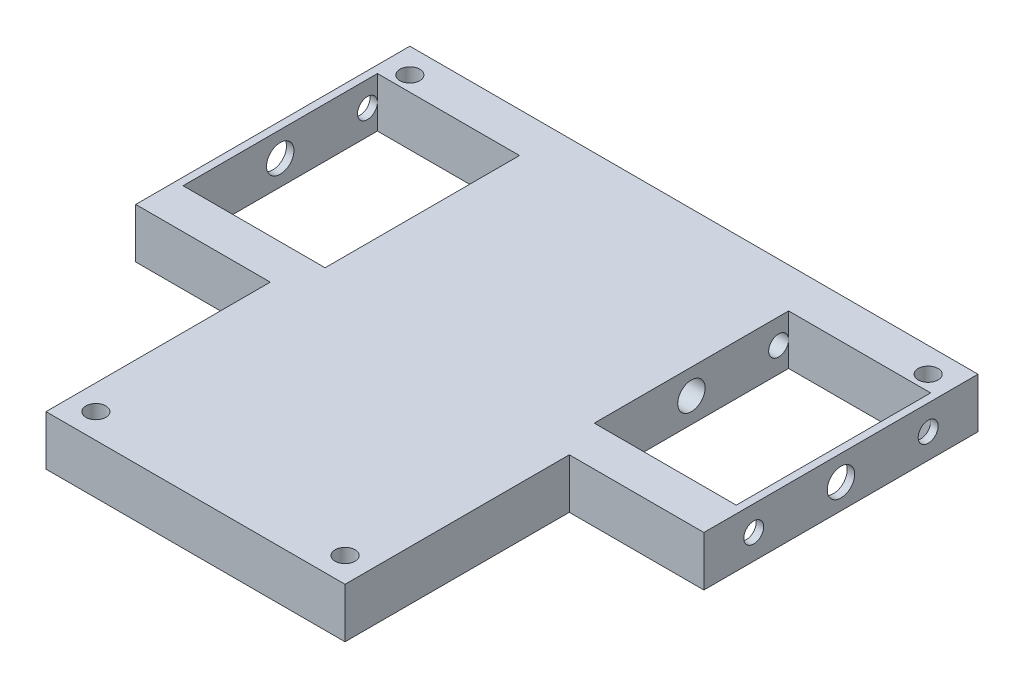
ISO-10303-21;
HEADER;
FILE_DESCRIPTION(('STEP AP214'),'2;1');
FILE_NAME('part.step','',(''),(''),'','','');
FILE_SCHEMA(('AUTOMOTIVE_DESIGN { 1 0 10303 214 1 1 1 1 }'));
ENDSEC;
DATA;
#1=APPLICATION_CONTEXT('core data for automotive mechanical design processes');
#2=APPLICATION_PROTOCOL_DEFINITION('international standard','automotive_design',2000,#1);
#3=PRODUCT_CONTEXT('',#1,'mechanical');
#4=PRODUCT('Part','Part','',(#3));
#5=PRODUCT_RELATED_PRODUCT_CATEGORY('part','',(#4));
#6=PRODUCT_DEFINITION_FORMATION('','',#4);
#7=PRODUCT_DEFINITION_CONTEXT('part definition',#1,'design');
#8=PRODUCT_DEFINITION('design','',#6,#7);
#9=PRODUCT_DEFINITION_SHAPE('','',#8);
#10=(LENGTH_UNIT() NAMED_UNIT(*) SI_UNIT(.MILLI.,.METRE.));
#11=(NAMED_UNIT(*) PLANE_ANGLE_UNIT() SI_UNIT($,.RADIAN.));
#12=(NAMED_UNIT(*) SI_UNIT($,.STERADIAN.) SOLID_ANGLE_UNIT());
#13=UNCERTAINTY_MEASURE_WITH_UNIT(LENGTH_MEASURE(1.E-05),#10,'distance_accuracy_value','');
#14=(GEOMETRIC_REPRESENTATION_CONTEXT(3) GLOBAL_UNCERTAINTY_ASSIGNED_CONTEXT((#13)) GLOBAL_UNIT_ASSIGNED_CONTEXT((#10,
#11,#12)) REPRESENTATION_CONTEXT('',''));
#15=CARTESIAN_POINT('',(0.,0.,0.));
#16=DIRECTION('',(0.,0.,1.));
#17=DIRECTION('',(1.,0.,0.));
#18=AXIS2_PLACEMENT_3D('',#15,#16,#17);
#19=CARTESIAN_POINT('',(0.,10.,0.));
#20=DIRECTION('',(0.,1.,0.));
#21=DIRECTION('',(0.,0.,1.));
#22=AXIS2_PLACEMENT_3D('',#19,#20,#21);
#23=PLANE('',#22);
#24=CARTESIAN_POINT('',(-25.,10.,-5.));
#25=DIRECTION('',(0.,1.,0.));
#26=DIRECTION('',(0.,0.,1.));
#27=AXIS2_PLACEMENT_3D('',#24,#25,#26);
#28=CIRCLE('',#27,2.);
#29=CARTESIAN_POINT('',(-25.,10.,-3.));
#30=VERTEX_POINT('',#29);
#31=EDGE_CURVE('E243',#30,#30,#28,.T.);
#32=ORIENTED_EDGE('',*,*,#31,.F.);
#33=EDGE_LOOP('',(#32));
#34=FACE_BOUND('',#33,.T.);
#35=DIRECTION('',(0.,0.,-1.));
#36=VECTOR('',#35,1.);
#37=CARTESIAN_POINT('',(-30.,10.,0.));
#38=LINE('',#37,#36);
#39=CARTESIAN_POINT('',(-30.,10.,0.));
#40=VERTEX_POINT('',#39);
#41=CARTESIAN_POINT('',(-30.,10.,-45.));
#42=VERTEX_POINT('',#41);
#43=EDGE_CURVE('E277',#40,#42,#38,.T.);
#44=ORIENTED_EDGE('',*,*,#43,.F.);
#45=DIRECTION('',(-1.,0.,0.));
#46=VECTOR('',#45,1.);
#47=CARTESIAN_POINT('',(30.,10.,0.));
#48=LINE('',#47,#46);
#49=CARTESIAN_POINT('',(30.,10.,0.));
#50=VERTEX_POINT('',#49);
#51=EDGE_CURVE('E296',#50,#40,#48,.T.);
#52=ORIENTED_EDGE('',*,*,#51,.F.);
#53=DIRECTION('',(0.,0.,-1.));
#54=VECTOR('',#53,1.);
#55=CARTESIAN_POINT('',(30.,10.,0.));
#56=LINE('',#55,#54);
#57=CARTESIAN_POINT('',(30.,10.,-45.));
#58=VERTEX_POINT('',#57);
#59=EDGE_CURVE('E294',#50,#58,#56,.T.);
#60=ORIENTED_EDGE('',*,*,#59,.T.);
#61=DIRECTION('',(1.,0.,0.));
#62=VECTOR('',#61,1.);
#63=CARTESIAN_POINT('',(30.,10.,-45.));
#64=LINE('',#63,#62);
#65=CARTESIAN_POINT('',(57.,10.,-45.));
#66=VERTEX_POINT('',#65);
#67=EDGE_CURVE('E292',#58,#66,#64,.T.);
#68=ORIENTED_EDGE('',*,*,#67,.T.);
#69=DIRECTION('',(0.,0.,-1.));
#70=VECTOR('',#69,1.);
#71=CARTESIAN_POINT('',(57.,10.,-45.));
#72=LINE('',#71,#70);
#73=CARTESIAN_POINT('',(57.,10.,-100.));
#74=VERTEX_POINT('',#73);
#75=EDGE_CURVE('E290',#66,#74,#72,.T.);
#76=ORIENTED_EDGE('',*,*,#75,.T.);
#77=DIRECTION('',(1.,0.,0.));
#78=VECTOR('',#77,1.);
#79=CARTESIAN_POINT('',(-57.,10.,-100.));
#80=LINE('',#79,#78);
#81=CARTESIAN_POINT('',(-57.,10.,-100.));
#82=VERTEX_POINT('',#81);
#83=EDGE_CURVE('E287',#82,#74,#80,.T.);
#84=ORIENTED_EDGE('',*,*,#83,.F.);
#85=DIRECTION('',(0.,0.,-1.));
#86=VECTOR('',#85,1.);
#87=CARTESIAN_POINT('',(-57.,10.,-45.));
#88=LINE('',#87,#86);
#89=CARTESIAN_POINT('',(-57.,10.,-45.));
#90=VERTEX_POINT('',#89);
#91=EDGE_CURVE('E284',#90,#82,#88,.T.);
#92=ORIENTED_EDGE('',*,*,#91,.F.);
#93=DIRECTION('',(-1.,0.,0.));
#94=VECTOR('',#93,1.);
#95=CARTESIAN_POINT('',(-30.,10.,-45.));
#96=LINE('',#95,#94);
#97=EDGE_CURVE('E280',#42,#90,#96,.T.);
#98=ORIENTED_EDGE('',*,*,#97,.F.);
#99=EDGE_LOOP('',(#44,#52,#60,#68,#76,#84,#92,#98));
#100=FACE_BOUND('',#99,.T.);
#101=CARTESIAN_POINT('',(52.,10.,-95.));
#102=DIRECTION('',(0.,1.,0.));
#103=DIRECTION('',(0.,0.,1.));
#104=AXIS2_PLACEMENT_3D('',#101,#102,#103);
#105=CIRCLE('',#104,2.);
#106=CARTESIAN_POINT('',(52.,10.,-93.));
#107=VERTEX_POINT('',#106);
#108=EDGE_CURVE('E240',#107,#107,#105,.F.);
#109=ORIENTED_EDGE('',*,*,#108,.T.);
#110=EDGE_LOOP('',(#109));
#111=FACE_BOUND('',#110,.T.);
#112=CARTESIAN_POINT('',(25.,10.,-5.00000000000006));
#113=DIRECTION('',(0.,1.,0.));
#114=DIRECTION('',(0.,0.,1.));
#115=AXIS2_PLACEMENT_3D('',#112,#113,#114);
#116=CIRCLE('',#115,2.);
#117=CARTESIAN_POINT('',(25.,10.,-3.00000000000005));
#118=VERTEX_POINT('',#117);
#119=EDGE_CURVE('E246',#118,#118,#116,.F.);
#120=ORIENTED_EDGE('',*,*,#119,.T.);
#121=EDGE_LOOP('',(#120));
#122=FACE_BOUND('',#121,.T.);
#123=DIRECTION('',(0.,0.,-1.));
#124=VECTOR('',#123,1.);
#125=CARTESIAN_POINT('',(-55.5,10.,0.));
#126=LINE('',#125,#124);
#127=CARTESIAN_POINT('',(-55.5,10.,-53.));
#128=VERTEX_POINT('',#127);
#129=CARTESIAN_POINT('',(-55.5,10.,-92.));
#130=VERTEX_POINT('',#129);
#131=EDGE_CURVE('E249',#128,#130,#126,.T.);
#132=ORIENTED_EDGE('',*,*,#131,.T.);
#133=DIRECTION('',(1.,0.,0.));
#134=VECTOR('',#133,1.);
#135=CARTESIAN_POINT('',(0.,10.,-92.));
#136=LINE('',#135,#134);
#137=CARTESIAN_POINT('',(-27.,10.,-92.));
#138=VERTEX_POINT('',#137);
#139=EDGE_CURVE('E258',#130,#138,#136,.T.);
#140=ORIENTED_EDGE('',*,*,#139,.T.);
#141=DIRECTION('',(0.,0.,1.));
#142=VECTOR('',#141,1.);
#143=CARTESIAN_POINT('',(-27.,10.,0.));
#144=LINE('',#143,#142);
#145=CARTESIAN_POINT('',(-27.,10.,-53.));
#146=VERTEX_POINT('',#145);
#147=EDGE_CURVE('E255',#138,#146,#144,.T.);
#148=ORIENTED_EDGE('',*,*,#147,.T.);
#149=DIRECTION('',(1.,0.,0.));
#150=VECTOR('',#149,1.);
#151=CARTESIAN_POINT('',(0.,10.,-53.));
#152=LINE('',#151,#150);
#153=EDGE_CURVE('E252',#128,#146,#152,.T.);
#154=ORIENTED_EDGE('',*,*,#153,.F.);
#155=EDGE_LOOP('',(#132,#140,#148,#154));
#156=FACE_BOUND('',#155,.T.);
#157=DIRECTION('',(-1.,0.,0.));
#158=VECTOR('',#157,1.);
#159=CARTESIAN_POINT('',(0.,10.,-92.));
#160=LINE('',#159,#158);
#161=CARTESIAN_POINT('',(55.5,10.,-92.));
#162=VERTEX_POINT('',#161);
#163=CARTESIAN_POINT('',(27.,10.,-92.));
#164=VERTEX_POINT('',#163);
#165=EDGE_CURVE('E270',#162,#164,#160,.T.);
#166=ORIENTED_EDGE('',*,*,#165,.F.);
#167=DIRECTION('',(0.,0.,-1.));
#168=VECTOR('',#167,1.);
#169=CARTESIAN_POINT('',(55.5,10.,0.));
#170=LINE('',#169,#168);
#171=CARTESIAN_POINT('',(55.5,10.,-53.));
#172=VERTEX_POINT('',#171);
#173=EDGE_CURVE('E267',#172,#162,#170,.T.);
#174=ORIENTED_EDGE('',*,*,#173,.F.);
#175=DIRECTION('',(-1.,0.,0.));
#176=VECTOR('',#175,1.);
#177=CARTESIAN_POINT('',(0.,10.,-53.));
#178=LINE('',#177,#176);
#179=CARTESIAN_POINT('',(27.,10.,-53.));
#180=VERTEX_POINT('',#179);
#181=EDGE_CURVE('E264',#172,#180,#178,.T.);
#182=ORIENTED_EDGE('',*,*,#181,.T.);
#183=DIRECTION('',(0.,0.,1.));
#184=VECTOR('',#183,1.);
#185=CARTESIAN_POINT('',(27.,10.,0.));
#186=LINE('',#185,#184);
#187=EDGE_CURVE('E261',#164,#180,#186,.T.);
#188=ORIENTED_EDGE('',*,*,#187,.F.);
#189=EDGE_LOOP('',(#166,#174,#182,#188));
#190=FACE_BOUND('',#189,.T.);
#191=CARTESIAN_POINT('',(-52.,10.,-95.));
#192=DIRECTION('',(0.,1.,0.));
#193=DIRECTION('',(0.,0.,1.));
#194=AXIS2_PLACEMENT_3D('',#191,#192,#193);
#195=CIRCLE('',#194,2.);
#196=CARTESIAN_POINT('',(-52.,10.,-93.));
#197=VERTEX_POINT('',#196);
#198=EDGE_CURVE('E273',#197,#197,#195,.T.);
#199=ORIENTED_EDGE('',*,*,#198,.F.);
#200=EDGE_LOOP('',(#199));
#201=FACE_BOUND('',#200,.T.);
#202=ADVANCED_FACE('F33',(#34,#100,#111,#122,#156,#190,#201),#23,.T.);
#203=CARTESIAN_POINT('',(0.,0.,0.));
#204=DIRECTION('',(0.,1.,0.));
#205=DIRECTION('',(0.,0.,1.));
#206=AXIS2_PLACEMENT_3D('',#203,#204,#205);
#207=PLANE('',#206);
#208=DIRECTION('',(0.,0.,-1.));
#209=VECTOR('',#208,1.);
#210=CARTESIAN_POINT('',(55.5,0.,-53.));
#211=LINE('',#210,#209);
#212=CARTESIAN_POINT('',(55.5,0.,-53.));
#213=VERTEX_POINT('',#212);
#214=CARTESIAN_POINT('',(55.5,0.,-92.));
#215=VERTEX_POINT('',#214);
#216=EDGE_CURVE('E208',#213,#215,#211,.T.);
#217=ORIENTED_EDGE('',*,*,#216,.T.);
#218=DIRECTION('',(-1.,0.,0.));
#219=VECTOR('',#218,1.);
#220=CARTESIAN_POINT('',(55.5,0.,-92.));
#221=LINE('',#220,#219);
#222=CARTESIAN_POINT('',(27.,0.,-92.));
#223=VERTEX_POINT('',#222);
#224=EDGE_CURVE('E230',#215,#223,#221,.T.);
#225=ORIENTED_EDGE('',*,*,#224,.T.);
#226=DIRECTION('',(0.,0.,1.));
#227=VECTOR('',#226,1.);
#228=CARTESIAN_POINT('',(27.,0.,-92.));
#229=LINE('',#228,#227);
#230=CARTESIAN_POINT('',(27.,0.,-53.));
#231=VERTEX_POINT('',#230);
#232=EDGE_CURVE('E227',#223,#231,#229,.T.);
#233=ORIENTED_EDGE('',*,*,#232,.T.);
#234=DIRECTION('',(-1.,0.,0.));
#235=VECTOR('',#234,1.);
#236=CARTESIAN_POINT('',(55.5,0.,-53.));
#237=LINE('',#236,#235);
#238=EDGE_CURVE('E224',#213,#231,#237,.T.);
#239=ORIENTED_EDGE('',*,*,#238,.F.);
#240=EDGE_LOOP('',(#217,#225,#233,#239));
#241=FACE_BOUND('',#240,.T.);
#242=CARTESIAN_POINT('',(-25.,0.,-5.));
#243=DIRECTION('',(0.,1.,0.));
#244=DIRECTION('',(0.,0.,1.));
#245=AXIS2_PLACEMENT_3D('',#242,#243,#244);
#246=CIRCLE('',#245,2.);
#247=CARTESIAN_POINT('',(-25.,0.,-3.));
#248=VERTEX_POINT('',#247);
#249=EDGE_CURVE('E200',#248,#248,#246,.T.);
#250=ORIENTED_EDGE('',*,*,#249,.T.);
#251=EDGE_LOOP('',(#250));
#252=FACE_BOUND('',#251,.T.);
#253=CARTESIAN_POINT('',(52.,0.,-95.));
#254=DIRECTION('',(0.,-1.,0.));
#255=DIRECTION('',(0.,0.,-1.));
#256=AXIS2_PLACEMENT_3D('',#253,#254,#255);
#257=CIRCLE('',#256,2.);
#258=CARTESIAN_POINT('',(52.,0.,-97.));
#259=VERTEX_POINT('',#258);
#260=EDGE_CURVE('E237',#259,#259,#257,.T.);
#261=ORIENTED_EDGE('',*,*,#260,.F.);
#262=EDGE_LOOP('',(#261));
#263=FACE_BOUND('',#262,.T.);
#264=DIRECTION('',(0.,0.,-1.));
#265=VECTOR('',#264,1.);
#266=CARTESIAN_POINT('',(-30.,0.,0.));
#267=LINE('',#266,#265);
#268=CARTESIAN_POINT('',(-30.,0.,0.));
#269=VERTEX_POINT('',#268);
#270=CARTESIAN_POINT('',(-30.,0.,-45.));
#271=VERTEX_POINT('',#270);
#272=EDGE_CURVE('E276',#269,#271,#267,.T.);
#273=ORIENTED_EDGE('',*,*,#272,.T.);
#274=DIRECTION('',(-1.,0.,0.));
#275=VECTOR('',#274,1.);
#276=CARTESIAN_POINT('',(-30.,0.,-45.));
#277=LINE('',#276,#275);
#278=CARTESIAN_POINT('',(-57.,0.,-45.));
#279=VERTEX_POINT('',#278);
#280=EDGE_CURVE('E302',#271,#279,#277,.T.);
#281=ORIENTED_EDGE('',*,*,#280,.T.);
#282=DIRECTION('',(0.,0.,-1.));
#283=VECTOR('',#282,1.);
#284=CARTESIAN_POINT('',(-57.,0.,-45.));
#285=LINE('',#284,#283);
#286=CARTESIAN_POINT('',(-57.,0.,-100.));
#287=VERTEX_POINT('',#286);
#288=EDGE_CURVE('E305',#279,#287,#285,.T.);
#289=ORIENTED_EDGE('',*,*,#288,.T.);
#290=DIRECTION('',(1.,0.,0.));
#291=VECTOR('',#290,1.);
#292=CARTESIAN_POINT('',(-57.,0.,-100.));
#293=LINE('',#292,#291);
#294=CARTESIAN_POINT('',(57.,0.,-100.));
#295=VERTEX_POINT('',#294);
#296=EDGE_CURVE('E308',#287,#295,#293,.T.);
#297=ORIENTED_EDGE('',*,*,#296,.T.);
#298=DIRECTION('',(0.,0.,-1.));
#299=VECTOR('',#298,1.);
#300=CARTESIAN_POINT('',(57.,0.,-45.));
#301=LINE('',#300,#299);
#302=CARTESIAN_POINT('',(57.,0.,-45.));
#303=VERTEX_POINT('',#302);
#304=EDGE_CURVE('E311',#303,#295,#301,.T.);
#305=ORIENTED_EDGE('',*,*,#304,.F.);
#306=DIRECTION('',(1.,0.,0.));
#307=VECTOR('',#306,1.);
#308=CARTESIAN_POINT('',(30.,0.,-45.));
#309=LINE('',#308,#307);
#310=CARTESIAN_POINT('',(30.,0.,-45.));
#311=VERTEX_POINT('',#310);
#312=EDGE_CURVE('E314',#311,#303,#309,.T.);
#313=ORIENTED_EDGE('',*,*,#312,.F.);
#314=DIRECTION('',(0.,0.,-1.));
#315=VECTOR('',#314,1.);
#316=CARTESIAN_POINT('',(30.,0.,0.));
#317=LINE('',#316,#315);
#318=CARTESIAN_POINT('',(30.,0.,0.));
#319=VERTEX_POINT('',#318);
#320=EDGE_CURVE('E316',#319,#311,#317,.T.);
#321=ORIENTED_EDGE('',*,*,#320,.F.);
#322=DIRECTION('',(-1.,0.,0.));
#323=VECTOR('',#322,1.);
#324=CARTESIAN_POINT('',(30.,0.,0.));
#325=LINE('',#324,#323);
#326=EDGE_CURVE('E281',#319,#269,#325,.T.);
#327=ORIENTED_EDGE('',*,*,#326,.T.);
#328=EDGE_LOOP('',(#273,#281,#289,#297,#305,#313,#321,#327));
#329=FACE_BOUND('',#328,.T.);
#330=CARTESIAN_POINT('',(25.,0.,-5.00000000000006));
#331=DIRECTION('',(0.,-1.,0.));
#332=DIRECTION('',(0.,0.,-1.));
#333=AXIS2_PLACEMENT_3D('',#330,#331,#332);
#334=CIRCLE('',#333,2.);
#335=CARTESIAN_POINT('',(25.,0.,-7.00000000000006));
#336=VERTEX_POINT('',#335);
#337=EDGE_CURVE('E197',#336,#336,#334,.T.);
#338=ORIENTED_EDGE('',*,*,#337,.F.);
#339=EDGE_LOOP('',(#338));
#340=FACE_BOUND('',#339,.T.);
#341=DIRECTION('',(1.,0.,0.));
#342=VECTOR('',#341,1.);
#343=CARTESIAN_POINT('',(-55.5,0.,-92.));
#344=LINE('',#343,#342);
#345=CARTESIAN_POINT('',(-55.5,0.,-92.));
#346=VERTEX_POINT('',#345);
#347=CARTESIAN_POINT('',(-27.,0.,-92.));
#348=VERTEX_POINT('',#347);
#349=EDGE_CURVE('E188',#346,#348,#344,.T.);
#350=ORIENTED_EDGE('',*,*,#349,.F.);
#351=DIRECTION('',(0.,0.,-1.));
#352=VECTOR('',#351,1.);
#353=CARTESIAN_POINT('',(-55.5,0.,-53.));
#354=LINE('',#353,#352);
#355=CARTESIAN_POINT('',(-55.5,0.,-53.));
#356=VERTEX_POINT('',#355);
#357=EDGE_CURVE('E170',#356,#346,#354,.T.);
#358=ORIENTED_EDGE('',*,*,#357,.F.);
#359=DIRECTION('',(1.,0.,0.));
#360=VECTOR('',#359,1.);
#361=CARTESIAN_POINT('',(-55.5,0.,-53.));
#362=LINE('',#361,#360);
#363=CARTESIAN_POINT('',(-27.,0.,-53.));
#364=VERTEX_POINT('',#363);
#365=EDGE_CURVE('E182',#356,#364,#362,.T.);
#366=ORIENTED_EDGE('',*,*,#365,.T.);
#367=DIRECTION('',(0.,0.,1.));
#368=VECTOR('',#367,1.);
#369=CARTESIAN_POINT('',(-27.,0.,-92.));
#370=LINE('',#369,#368);
#371=EDGE_CURVE('E196',#348,#364,#370,.T.);
#372=ORIENTED_EDGE('',*,*,#371,.F.);
#373=EDGE_LOOP('',(#350,#358,#366,#372));
#374=FACE_BOUND('',#373,.T.);
#375=CARTESIAN_POINT('',(-52.,0.,-95.));
#376=DIRECTION('',(0.,1.,0.));
#377=DIRECTION('',(0.,0.,1.));
#378=AXIS2_PLACEMENT_3D('',#375,#376,#377);
#379=CIRCLE('',#378,2.);
#380=CARTESIAN_POINT('',(-52.,0.,-93.));
#381=VERTEX_POINT('',#380);
#382=EDGE_CURVE('E234',#381,#381,#379,.T.);
#383=ORIENTED_EDGE('',*,*,#382,.T.);
#384=EDGE_LOOP('',(#383));
#385=FACE_BOUND('',#384,.T.);
#386=ADVANCED_FACE('F194',(#241,#252,#263,#329,#340,#374,#385),#207,.F.);
#387=CARTESIAN_POINT('',(-30.,10.,0.));
#388=DIRECTION('',(-1.,0.,0.));
#389=DIRECTION('',(0.,0.,1.));
#390=AXIS2_PLACEMENT_3D('',#387,#388,#389);
#391=PLANE('',#390);
#392=ORIENTED_EDGE('',*,*,#272,.F.);
#393=DIRECTION('',(0.,-1.,0.));
#394=VECTOR('',#393,1.);
#395=CARTESIAN_POINT('',(-30.,10.,0.));
#396=LINE('',#395,#394);
#397=EDGE_CURVE('E11',#40,#269,#396,.T.);
#398=ORIENTED_EDGE('',*,*,#397,.F.);
#399=ORIENTED_EDGE('',*,*,#43,.T.);
#400=DIRECTION('',(0.,-1.,0.));
#401=VECTOR('',#400,1.);
#402=CARTESIAN_POINT('',(-30.,10.,-45.));
#403=LINE('',#402,#401);
#404=EDGE_CURVE('E299',#42,#271,#403,.T.);
#405=ORIENTED_EDGE('',*,*,#404,.T.);
#406=EDGE_LOOP('',(#392,#398,#399,#405));
#407=FACE_BOUND('',#406,.T.);
#408=ADVANCED_FACE('F35',(#407),#391,.T.);
#409=CARTESIAN_POINT('',(30.,10.,0.));
#410=DIRECTION('',(0.,0.,1.));
#411=DIRECTION('',(1.,0.,0.));
#412=AXIS2_PLACEMENT_3D('',#409,#410,#411);
#413=PLANE('',#412);
#414=ORIENTED_EDGE('',*,*,#326,.F.);
#415=DIRECTION('',(0.,-1.,0.));
#416=VECTOR('',#415,1.);
#417=CARTESIAN_POINT('',(30.,10.,0.));
#418=LINE('',#417,#416);
#419=EDGE_CURVE('E42',#50,#319,#418,.T.);
#420=ORIENTED_EDGE('',*,*,#419,.F.);
#421=ORIENTED_EDGE('',*,*,#51,.T.);
#422=ORIENTED_EDGE('',*,*,#397,.T.);
#423=EDGE_LOOP('',(#414,#420,#421,#422));
#424=FACE_BOUND('',#423,.T.);
#425=ADVANCED_FACE('F450',(#424),#413,.T.);
#426=CARTESIAN_POINT('',(30.,10.,0.));
#427=DIRECTION('',(-1.,0.,0.));
#428=DIRECTION('',(0.,0.,1.));
#429=AXIS2_PLACEMENT_3D('',#426,#427,#428);
#430=PLANE('',#429);
#431=ORIENTED_EDGE('',*,*,#320,.T.);
#432=DIRECTION('',(0.,-1.,0.));
#433=VECTOR('',#432,1.);
#434=CARTESIAN_POINT('',(30.,10.,-45.));
#435=LINE('',#434,#433);
#436=EDGE_CURVE('E321',#58,#311,#435,.T.);
#437=ORIENTED_EDGE('',*,*,#436,.F.);
#438=ORIENTED_EDGE('',*,*,#59,.F.);
#439=ORIENTED_EDGE('',*,*,#419,.T.);
#440=EDGE_LOOP('',(#431,#437,#438,#439));
#441=FACE_BOUND('',#440,.T.);
#442=ADVANCED_FACE('F453',(#441),#430,.F.);
#443=CARTESIAN_POINT('',(30.,10.,-45.));
#444=DIRECTION('',(0.,0.,-1.));
#445=DIRECTION('',(-1.,0.,0.));
#446=AXIS2_PLACEMENT_3D('',#443,#444,#445);
#447=PLANE('',#446);
#448=ORIENTED_EDGE('',*,*,#312,.T.);
#449=DIRECTION('',(0.,-1.,0.));
#450=VECTOR('',#449,1.);
#451=CARTESIAN_POINT('',(57.,10.,-45.));
#452=LINE('',#451,#450);
#453=EDGE_CURVE('E324',#66,#303,#452,.T.);
#454=ORIENTED_EDGE('',*,*,#453,.F.);
#455=ORIENTED_EDGE('',*,*,#67,.F.);
#456=ORIENTED_EDGE('',*,*,#436,.T.);
#457=EDGE_LOOP('',(#448,#454,#455,#456));
#458=FACE_BOUND('',#457,.T.);
#459=ADVANCED_FACE('F457',(#458),#447,.F.);
#460=CARTESIAN_POINT('',(57.,10.,-45.));
#461=DIRECTION('',(-1.,0.,0.));
#462=DIRECTION('',(0.,0.,1.));
#463=AXIS2_PLACEMENT_3D('',#460,#461,#462);
#464=PLANE('',#463);
#465=CARTESIAN_POINT('',(57.,5.,-55.));
#466=DIRECTION('',(1.,0.,0.));
#467=DIRECTION('',(0.,0.,-1.));
#468=AXIS2_PLACEMENT_3D('',#465,#466,#467);
#469=CIRCLE('',#468,2.);
#470=CARTESIAN_POINT('',(57.,5.,-57.));
#471=VERTEX_POINT('',#470);
#472=EDGE_CURVE('E398',#471,#471,#469,.T.);
#473=ORIENTED_EDGE('',*,*,#472,.F.);
#474=EDGE_LOOP('',(#473));
#475=FACE_BOUND('',#474,.T.);
#476=CARTESIAN_POINT('',(57.,5.,-90.));
#477=DIRECTION('',(1.,0.,0.));
#478=DIRECTION('',(0.,0.,1.));
#479=AXIS2_PLACEMENT_3D('',#476,#477,#478);
#480=CIRCLE('',#479,2.);
#481=CARTESIAN_POINT('',(57.,5.,-88.));
#482=VERTEX_POINT('',#481);
#483=EDGE_CURVE('E399',#482,#482,#480,.T.);
#484=ORIENTED_EDGE('',*,*,#483,.F.);
#485=EDGE_LOOP('',(#484));
#486=FACE_BOUND('',#485,.T.);
#487=CARTESIAN_POINT('',(57.,5.,-72.5));
#488=DIRECTION('',(1.,0.,0.));
#489=DIRECTION('',(0.,0.,-1.));
#490=AXIS2_PLACEMENT_3D('',#487,#488,#489);
#491=CIRCLE('',#490,2.75000000000001);
#492=CARTESIAN_POINT('',(57.,5.,-75.25));
#493=VERTEX_POINT('',#492);
#494=EDGE_CURVE('E410',#493,#493,#491,.T.);
#495=ORIENTED_EDGE('',*,*,#494,.F.);
#496=EDGE_LOOP('',(#495));
#497=FACE_BOUND('',#496,.T.);
#498=ORIENTED_EDGE('',*,*,#304,.T.);
#499=DIRECTION('',(0.,-1.,0.));
#500=VECTOR('',#499,1.);
#501=CARTESIAN_POINT('',(57.,10.,-100.));
#502=LINE('',#501,#500);
#503=EDGE_CURVE('E327',#74,#295,#502,.T.);
#504=ORIENTED_EDGE('',*,*,#503,.F.);
#505=ORIENTED_EDGE('',*,*,#75,.F.);
#506=ORIENTED_EDGE('',*,*,#453,.T.);
#507=EDGE_LOOP('',(#498,#504,#505,#506));
#508=FACE_BOUND('',#507,.T.);
#509=ADVANCED_FACE('F461',(#475,#486,#497,#508),#464,.F.);
#510=CARTESIAN_POINT('',(-57.,10.,-100.));
#511=DIRECTION('',(0.,0.,-1.));
#512=DIRECTION('',(-1.,0.,0.));
#513=AXIS2_PLACEMENT_3D('',#510,#511,#512);
#514=PLANE('',#513);
#515=ORIENTED_EDGE('',*,*,#296,.F.);
#516=DIRECTION('',(0.,-1.,0.));
#517=VECTOR('',#516,1.);
#518=CARTESIAN_POINT('',(-57.,10.,-100.));
#519=LINE('',#518,#517);
#520=EDGE_CURVE('E329',#82,#287,#519,.T.);
#521=ORIENTED_EDGE('',*,*,#520,.F.);
#522=ORIENTED_EDGE('',*,*,#83,.T.);
#523=ORIENTED_EDGE('',*,*,#503,.T.);
#524=EDGE_LOOP('',(#515,#521,#522,#523));
#525=FACE_BOUND('',#524,.T.);
#526=ADVANCED_FACE('F465',(#525),#514,.T.);
#527=CARTESIAN_POINT('',(-57.,10.,-45.));
#528=DIRECTION('',(-1.,0.,0.));
#529=DIRECTION('',(0.,0.,1.));
#530=AXIS2_PLACEMENT_3D('',#527,#528,#529);
#531=PLANE('',#530);
#532=CARTESIAN_POINT('',(-57.,5.,-55.));
#533=DIRECTION('',(1.,0.,0.));
#534=DIRECTION('',(0.,0.,-1.));
#535=AXIS2_PLACEMENT_3D('',#532,#533,#534);
#536=CIRCLE('',#535,2.);
#537=CARTESIAN_POINT('',(-57.,5.,-57.));
#538=VERTEX_POINT('',#537);
#539=EDGE_CURVE('E337',#538,#538,#536,.T.);
#540=ORIENTED_EDGE('',*,*,#539,.T.);
#541=EDGE_LOOP('',(#540));
#542=FACE_BOUND('',#541,.T.);
#543=CARTESIAN_POINT('',(-57.,5.,-90.));
#544=DIRECTION('',(1.,0.,0.));
#545=DIRECTION('',(0.,0.,1.));
#546=AXIS2_PLACEMENT_3D('',#543,#544,#545);
#547=CIRCLE('',#546,2.);
#548=CARTESIAN_POINT('',(-57.,5.,-88.));
#549=VERTEX_POINT('',#548);
#550=EDGE_CURVE('E396',#549,#549,#547,.T.);
#551=ORIENTED_EDGE('',*,*,#550,.T.);
#552=EDGE_LOOP('',(#551));
#553=FACE_BOUND('',#552,.T.);
#554=CARTESIAN_POINT('',(-57.,5.,-72.5));
#555=DIRECTION('',(1.,0.,0.));
#556=DIRECTION('',(0.,0.,-1.));
#557=AXIS2_PLACEMENT_3D('',#554,#555,#556);
#558=CIRCLE('',#557,2.75000000000001);
#559=CARTESIAN_POINT('',(-57.,5.,-75.25));
#560=VERTEX_POINT('',#559);
#561=EDGE_CURVE('E404',#560,#560,#558,.T.);
#562=ORIENTED_EDGE('',*,*,#561,.T.);
#563=EDGE_LOOP('',(#562));
#564=FACE_BOUND('',#563,.T.);
#565=ORIENTED_EDGE('',*,*,#288,.F.);
#566=DIRECTION('',(0.,-1.,0.));
#567=VECTOR('',#566,1.);
#568=CARTESIAN_POINT('',(-57.,10.,-45.));
#569=LINE('',#568,#567);
#570=EDGE_CURVE('E331',#90,#279,#569,.T.);
#571=ORIENTED_EDGE('',*,*,#570,.F.);
#572=ORIENTED_EDGE('',*,*,#91,.T.);
#573=ORIENTED_EDGE('',*,*,#520,.T.);
#574=EDGE_LOOP('',(#565,#571,#572,#573));
#575=FACE_BOUND('',#574,.T.);
#576=ADVANCED_FACE('F469',(#542,#553,#564,#575),#531,.T.);
#577=CARTESIAN_POINT('',(-30.,10.,-45.));
#578=DIRECTION('',(0.,0.,1.));
#579=DIRECTION('',(1.,0.,0.));
#580=AXIS2_PLACEMENT_3D('',#577,#578,#579);
#581=PLANE('',#580);
#582=ORIENTED_EDGE('',*,*,#280,.F.);
#583=ORIENTED_EDGE('',*,*,#404,.F.);
#584=ORIENTED_EDGE('',*,*,#97,.T.);
#585=ORIENTED_EDGE('',*,*,#570,.T.);
#586=EDGE_LOOP('',(#582,#583,#584,#585));
#587=FACE_BOUND('',#586,.T.);
#588=ADVANCED_FACE('F472',(#587),#581,.T.);
#589=CARTESIAN_POINT('',(52.,0.,-95.));
#590=DIRECTION('',(0.,1.,0.));
#591=DIRECTION('',(0.,0.,1.));
#592=AXIS2_PLACEMENT_3D('',#589,#590,#591);
#593=CYLINDRICAL_SURFACE('',#592,2.);
#594=ORIENTED_EDGE('',*,*,#108,.F.);
#595=EDGE_LOOP('',(#594));
#596=FACE_BOUND('',#595,.T.);
#597=ORIENTED_EDGE('',*,*,#260,.T.);
#598=EDGE_LOOP('',(#597));
#599=FACE_BOUND('',#598,.T.);
#600=ADVANCED_FACE('F447',(#596,#599),#593,.F.);
#601=CARTESIAN_POINT('',(-25.,0.,-5.));
#602=DIRECTION('',(0.,1.,0.));
#603=DIRECTION('',(0.,0.,1.));
#604=AXIS2_PLACEMENT_3D('',#601,#602,#603);
#605=CYLINDRICAL_SURFACE('',#604,2.);
#606=ORIENTED_EDGE('',*,*,#31,.T.);
#607=EDGE_LOOP('',(#606));
#608=FACE_BOUND('',#607,.T.);
#609=ORIENTED_EDGE('',*,*,#249,.F.);
#610=EDGE_LOOP('',(#609));
#611=FACE_BOUND('',#610,.T.);
#612=ADVANCED_FACE('F479',(#608,#611),#605,.F.);
#613=CARTESIAN_POINT('',(25.,0.,-5.00000000000006));
#614=DIRECTION('',(0.,1.,0.));
#615=DIRECTION('',(0.,0.,1.));
#616=AXIS2_PLACEMENT_3D('',#613,#614,#615);
#617=CYLINDRICAL_SURFACE('',#616,2.);
#618=ORIENTED_EDGE('',*,*,#119,.F.);
#619=EDGE_LOOP('',(#618));
#620=FACE_BOUND('',#619,.T.);
#621=ORIENTED_EDGE('',*,*,#337,.T.);
#622=EDGE_LOOP('',(#621));
#623=FACE_BOUND('',#622,.T.);
#624=ADVANCED_FACE('F510',(#620,#623),#617,.F.);
#625=CARTESIAN_POINT('',(-55.5,0.,-92.));
#626=DIRECTION('',(0.,0.,1.));
#627=DIRECTION('',(1.,0.,0.));
#628=AXIS2_PLACEMENT_3D('',#625,#626,#627);
#629=PLANE('',#628);
#630=DIRECTION('',(0.,1.,0.));
#631=VECTOR('',#630,1.);
#632=CARTESIAN_POINT('',(-27.,0.,-92.));
#633=LINE('',#632,#631);
#634=CARTESIAN_POINT('',(-27.,5.,-92.));
#635=VERTEX_POINT('',#634);
#636=EDGE_CURVE('E366',#348,#635,#633,.T.);
#637=ORIENTED_EDGE('',*,*,#636,.T.);
#638=EDGE_CURVE('E233',#635,#138,#633,.T.);
#639=ORIENTED_EDGE('',*,*,#638,.T.);
#640=ORIENTED_EDGE('',*,*,#139,.F.);
#641=DIRECTION('',(0.,1.,0.));
#642=VECTOR('',#641,1.);
#643=CARTESIAN_POINT('',(-55.5,0.,-92.));
#644=LINE('',#643,#642);
#645=CARTESIAN_POINT('',(-55.5,5.,-92.));
#646=VERTEX_POINT('',#645);
#647=EDGE_CURVE('E191',#646,#130,#644,.T.);
#648=ORIENTED_EDGE('',*,*,#647,.F.);
#649=EDGE_CURVE('E175',#346,#646,#644,.T.);
#650=ORIENTED_EDGE('',*,*,#649,.F.);
#651=ORIENTED_EDGE('',*,*,#349,.T.);
#652=EDGE_LOOP('',(#637,#639,#640,#648,#650,#651));
#653=FACE_BOUND('',#652,.T.);
#654=ADVANCED_FACE('F187',(#653),#629,.T.);
#655=CARTESIAN_POINT('',(-27.,0.,-92.));
#656=DIRECTION('',(-1.,0.,0.));
#657=DIRECTION('',(0.,0.,1.));
#658=AXIS2_PLACEMENT_3D('',#655,#656,#657);
#659=PLANE('',#658);
#660=CARTESIAN_POINT('',(-27.,5.,-72.5));
#661=DIRECTION('',(-1.,0.,0.));
#662=DIRECTION('',(0.,0.,1.));
#663=AXIS2_PLACEMENT_3D('',#660,#661,#662);
#664=CIRCLE('',#663,2.75000000000001);
#665=CARTESIAN_POINT('',(-27.,5.,-69.75));
#666=VERTEX_POINT('',#665);
#667=EDGE_CURVE('E341',#666,#666,#664,.T.);
#668=ORIENTED_EDGE('',*,*,#667,.F.);
#669=EDGE_LOOP('',(#668));
#670=FACE_BOUND('',#669,.T.);
#671=DIRECTION('',(0.,1.,0.));
#672=VECTOR('',#671,1.);
#673=CARTESIAN_POINT('',(-27.,0.,-53.));
#674=LINE('',#673,#672);
#675=CARTESIAN_POINT('',(-27.,5.,-53.));
#676=VERTEX_POINT('',#675);
#677=EDGE_CURVE('E369',#364,#676,#674,.T.);
#678=ORIENTED_EDGE('',*,*,#677,.T.);
#679=CARTESIAN_POINT('',(-27.,5.,-55.));
#680=DIRECTION('',(-1.,0.,0.));
#681=DIRECTION('',(0.,0.,1.));
#682=AXIS2_PLACEMENT_3D('',#679,#680,#681);
#683=CIRCLE('',#682,2.);
#684=EDGE_CURVE('E53',#676,#676,#683,.T.);
#685=ORIENTED_EDGE('',*,*,#684,.F.);
#686=EDGE_CURVE('E368',#676,#146,#674,.T.);
#687=ORIENTED_EDGE('',*,*,#686,.T.);
#688=ORIENTED_EDGE('',*,*,#147,.F.);
#689=ORIENTED_EDGE('',*,*,#638,.F.);
#690=CARTESIAN_POINT('',(-27.,5.,-90.));
#691=DIRECTION('',(-1.,0.,0.));
#692=DIRECTION('',(0.,0.,1.));
#693=AXIS2_PLACEMENT_3D('',#690,#691,#692);
#694=CIRCLE('',#693,2.);
#695=EDGE_CURVE('E48',#635,#635,#694,.T.);
#696=ORIENTED_EDGE('',*,*,#695,.F.);
#697=ORIENTED_EDGE('',*,*,#636,.F.);
#698=ORIENTED_EDGE('',*,*,#371,.T.);
#699=EDGE_LOOP('',(#678,#685,#687,#688,#689,#696,#697,#698));
#700=FACE_BOUND('',#699,.T.);
#701=ADVANCED_FACE('F378',(#670,#700),#659,.T.);
#702=CARTESIAN_POINT('',(-55.5,0.,-53.));
#703=DIRECTION('',(0.,0.,1.));
#704=DIRECTION('',(1.,0.,0.));
#705=AXIS2_PLACEMENT_3D('',#702,#703,#704);
#706=PLANE('',#705);
#707=DIRECTION('',(0.,1.,0.));
#708=VECTOR('',#707,1.);
#709=CARTESIAN_POINT('',(-55.5,0.,-53.));
#710=LINE('',#709,#708);
#711=CARTESIAN_POINT('',(-55.5,5.,-53.));
#712=VERTEX_POINT('',#711);
#713=EDGE_CURVE('E178',#356,#712,#710,.T.);
#714=ORIENTED_EDGE('',*,*,#713,.T.);
#715=EDGE_CURVE('E372',#712,#128,#710,.T.);
#716=ORIENTED_EDGE('',*,*,#715,.T.);
#717=ORIENTED_EDGE('',*,*,#153,.T.);
#718=ORIENTED_EDGE('',*,*,#686,.F.);
#719=ORIENTED_EDGE('',*,*,#677,.F.);
#720=ORIENTED_EDGE('',*,*,#365,.F.);
#721=EDGE_LOOP('',(#714,#716,#717,#718,#719,#720));
#722=FACE_BOUND('',#721,.T.);
#723=ADVANCED_FACE('F375',(#722),#706,.F.);
#724=CARTESIAN_POINT('',(-55.5,0.,-53.));
#725=DIRECTION('',(1.,0.,0.));
#726=DIRECTION('',(0.,0.,-1.));
#727=AXIS2_PLACEMENT_3D('',#724,#725,#726);
#728=PLANE('',#727);
#729=CARTESIAN_POINT('',(-55.5,5.,-72.5));
#730=DIRECTION('',(1.,0.,0.));
#731=DIRECTION('',(0.,0.,-1.));
#732=AXIS2_PLACEMENT_3D('',#729,#730,#731);
#733=CIRCLE('',#732,2.75000000000001);
#734=CARTESIAN_POINT('',(-55.5,5.,-75.25));
#735=VERTEX_POINT('',#734);
#736=EDGE_CURVE('E348',#735,#735,#733,.T.);
#737=ORIENTED_EDGE('',*,*,#736,.F.);
#738=EDGE_LOOP('',(#737));
#739=FACE_BOUND('',#738,.T.);
#740=ORIENTED_EDGE('',*,*,#715,.F.);
#741=CARTESIAN_POINT('',(-55.5,5.,-55.));
#742=DIRECTION('',(1.,0.,0.));
#743=DIRECTION('',(0.,0.,-1.));
#744=AXIS2_PLACEMENT_3D('',#741,#742,#743);
#745=CIRCLE('',#744,2.);
#746=EDGE_CURVE('E361',#712,#712,#745,.T.);
#747=ORIENTED_EDGE('',*,*,#746,.F.);
#748=ORIENTED_EDGE('',*,*,#713,.F.);
#749=ORIENTED_EDGE('',*,*,#357,.T.);
#750=ORIENTED_EDGE('',*,*,#649,.T.);
#751=CARTESIAN_POINT('',(-55.5,5.,-90.));
#752=DIRECTION('',(1.,0.,0.));
#753=DIRECTION('',(0.,0.,-1.));
#754=AXIS2_PLACEMENT_3D('',#751,#752,#753);
#755=CIRCLE('',#754,2.);
#756=EDGE_CURVE('E345',#646,#646,#755,.T.);
#757=ORIENTED_EDGE('',*,*,#756,.F.);
#758=ORIENTED_EDGE('',*,*,#647,.T.);
#759=ORIENTED_EDGE('',*,*,#131,.F.);
#760=EDGE_LOOP('',(#740,#747,#748,#749,#750,#757,#758,#759));
#761=FACE_BOUND('',#760,.T.);
#762=ADVANCED_FACE('F173',(#739,#761),#728,.T.);
#763=CARTESIAN_POINT('',(55.5,0.,-92.));
#764=DIRECTION('',(0.,0.,-1.));
#765=DIRECTION('',(-1.,0.,0.));
#766=AXIS2_PLACEMENT_3D('',#763,#764,#765);
#767=PLANE('',#766);
#768=DIRECTION('',(0.,1.,0.));
#769=VECTOR('',#768,1.);
#770=CARTESIAN_POINT('',(27.,0.,-92.));
#771=LINE('',#770,#769);
#772=CARTESIAN_POINT('',(27.,5.,-92.));
#773=VERTEX_POINT('',#772);
#774=EDGE_CURVE('E209',#773,#164,#771,.T.);
#775=ORIENTED_EDGE('',*,*,#774,.F.);
#776=EDGE_CURVE('E205',#223,#773,#771,.T.);
#777=ORIENTED_EDGE('',*,*,#776,.F.);
#778=ORIENTED_EDGE('',*,*,#224,.F.);
#779=DIRECTION('',(0.,1.,0.));
#780=VECTOR('',#779,1.);
#781=CARTESIAN_POINT('',(55.5,0.,-92.));
#782=LINE('',#781,#780);
#783=CARTESIAN_POINT('',(55.5,5.,-92.));
#784=VERTEX_POINT('',#783);
#785=EDGE_CURVE('E218',#215,#784,#782,.T.);
#786=ORIENTED_EDGE('',*,*,#785,.T.);
#787=EDGE_CURVE('E221',#784,#162,#782,.T.);
#788=ORIENTED_EDGE('',*,*,#787,.T.);
#789=ORIENTED_EDGE('',*,*,#165,.T.);
#790=EDGE_LOOP('',(#775,#777,#778,#786,#788,#789));
#791=FACE_BOUND('',#790,.T.);
#792=ADVANCED_FACE('F529',(#791),#767,.F.);
#793=CARTESIAN_POINT('',(55.5,0.,-53.));
#794=DIRECTION('',(1.,0.,0.));
#795=DIRECTION('',(0.,0.,-1.));
#796=AXIS2_PLACEMENT_3D('',#793,#794,#795);
#797=PLANE('',#796);
#798=CARTESIAN_POINT('',(55.5,5.,-72.5));
#799=DIRECTION('',(1.,0.,0.));
#800=DIRECTION('',(0.,0.,-1.));
#801=AXIS2_PLACEMENT_3D('',#798,#799,#800);
#802=CIRCLE('',#801,2.75000000000001);
#803=CARTESIAN_POINT('',(55.5,5.,-75.25));
#804=VERTEX_POINT('',#803);
#805=EDGE_CURVE('E336',#804,#804,#802,.T.);
#806=ORIENTED_EDGE('',*,*,#805,.T.);
#807=EDGE_LOOP('',(#806));
#808=FACE_BOUND('',#807,.T.);
#809=DIRECTION('',(0.,1.,0.));
#810=VECTOR('',#809,1.);
#811=CARTESIAN_POINT('',(55.5,0.,-53.));
#812=LINE('',#811,#810);
#813=CARTESIAN_POINT('',(55.5,5.,-53.));
#814=VERTEX_POINT('',#813);
#815=EDGE_CURVE('E214',#213,#814,#812,.T.);
#816=ORIENTED_EDGE('',*,*,#815,.T.);
#817=CARTESIAN_POINT('',(55.5,5.,-55.));
#818=DIRECTION('',(1.,0.,0.));
#819=DIRECTION('',(0.,0.,-1.));
#820=AXIS2_PLACEMENT_3D('',#817,#818,#819);
#821=CIRCLE('',#820,2.);
#822=EDGE_CURVE('E358',#814,#814,#821,.T.);
#823=ORIENTED_EDGE('',*,*,#822,.T.);
#824=EDGE_CURVE('E217',#814,#172,#812,.T.);
#825=ORIENTED_EDGE('',*,*,#824,.T.);
#826=ORIENTED_EDGE('',*,*,#173,.T.);
#827=ORIENTED_EDGE('',*,*,#787,.F.);
#828=CARTESIAN_POINT('',(55.5,5.,-90.));
#829=DIRECTION('',(1.,0.,0.));
#830=DIRECTION('',(0.,0.,-1.));
#831=AXIS2_PLACEMENT_3D('',#828,#829,#830);
#832=CIRCLE('',#831,2.);
#833=EDGE_CURVE('E340',#784,#784,#832,.T.);
#834=ORIENTED_EDGE('',*,*,#833,.T.);
#835=ORIENTED_EDGE('',*,*,#785,.F.);
#836=ORIENTED_EDGE('',*,*,#216,.F.);
#837=EDGE_LOOP('',(#816,#823,#825,#826,#827,#834,#835,#836));
#838=FACE_BOUND('',#837,.T.);
#839=ADVANCED_FACE('F415',(#808,#838),#797,.F.);
#840=CARTESIAN_POINT('',(55.5,0.,-53.));
#841=DIRECTION('',(0.,0.,-1.));
#842=DIRECTION('',(-1.,0.,0.));
#843=AXIS2_PLACEMENT_3D('',#840,#841,#842);
#844=PLANE('',#843);
#845=ORIENTED_EDGE('',*,*,#824,.F.);
#846=ORIENTED_EDGE('',*,*,#815,.F.);
#847=ORIENTED_EDGE('',*,*,#238,.T.);
#848=DIRECTION('',(0.,1.,0.));
#849=VECTOR('',#848,1.);
#850=CARTESIAN_POINT('',(27.,0.,-53.));
#851=LINE('',#850,#849);
#852=CARTESIAN_POINT('',(27.,5.,-53.));
#853=VERTEX_POINT('',#852);
#854=EDGE_CURVE('E210',#231,#853,#851,.T.);
#855=ORIENTED_EDGE('',*,*,#854,.T.);
#856=EDGE_CURVE('E213',#853,#180,#851,.T.);
#857=ORIENTED_EDGE('',*,*,#856,.T.);
#858=ORIENTED_EDGE('',*,*,#181,.F.);
#859=EDGE_LOOP('',(#845,#846,#847,#855,#857,#858));
#860=FACE_BOUND('',#859,.T.);
#861=ADVANCED_FACE('F537',(#860),#844,.T.);
#862=CARTESIAN_POINT('',(27.,0.,-92.));
#863=DIRECTION('',(-1.,0.,0.));
#864=DIRECTION('',(0.,0.,1.));
#865=AXIS2_PLACEMENT_3D('',#862,#863,#864);
#866=PLANE('',#865);
#867=CARTESIAN_POINT('',(27.,5.,-72.5));
#868=DIRECTION('',(-1.,0.,0.));
#869=DIRECTION('',(0.,0.,1.));
#870=AXIS2_PLACEMENT_3D('',#867,#868,#869);
#871=CIRCLE('',#870,2.75000000000001);
#872=CARTESIAN_POINT('',(27.,5.,-69.75));
#873=VERTEX_POINT('',#872);
#874=EDGE_CURVE('E334',#873,#873,#871,.T.);
#875=ORIENTED_EDGE('',*,*,#874,.T.);
#876=EDGE_LOOP('',(#875));
#877=FACE_BOUND('',#876,.T.);
#878=ORIENTED_EDGE('',*,*,#856,.F.);
#879=CARTESIAN_POINT('',(27.,5.,-55.));
#880=DIRECTION('',(-1.,0.,0.));
#881=DIRECTION('',(0.,0.,1.));
#882=AXIS2_PLACEMENT_3D('',#879,#880,#881);
#883=CIRCLE('',#882,2.);
#884=EDGE_CURVE('E37',#853,#853,#883,.T.);
#885=ORIENTED_EDGE('',*,*,#884,.T.);
#886=ORIENTED_EDGE('',*,*,#854,.F.);
#887=ORIENTED_EDGE('',*,*,#232,.F.);
#888=ORIENTED_EDGE('',*,*,#776,.T.);
#889=CARTESIAN_POINT('',(27.,5.,-90.));
#890=DIRECTION('',(-1.,0.,0.));
#891=DIRECTION('',(0.,0.,1.));
#892=AXIS2_PLACEMENT_3D('',#889,#890,#891);
#893=CIRCLE('',#892,2.);
#894=EDGE_CURVE('E338',#773,#773,#893,.T.);
#895=ORIENTED_EDGE('',*,*,#894,.T.);
#896=ORIENTED_EDGE('',*,*,#774,.T.);
#897=ORIENTED_EDGE('',*,*,#187,.T.);
#898=EDGE_LOOP('',(#878,#885,#886,#887,#888,#895,#896,#897));
#899=FACE_BOUND('',#898,.T.);
#900=ADVANCED_FACE('F534',(#877,#899),#866,.F.);
#901=CARTESIAN_POINT('',(-52.,0.,-95.));
#902=DIRECTION('',(0.,1.,0.));
#903=DIRECTION('',(0.,0.,1.));
#904=AXIS2_PLACEMENT_3D('',#901,#902,#903);
#905=CYLINDRICAL_SURFACE('',#904,2.);
#906=ORIENTED_EDGE('',*,*,#198,.T.);
#907=EDGE_LOOP('',(#906));
#908=FACE_BOUND('',#907,.T.);
#909=ORIENTED_EDGE('',*,*,#382,.F.);
#910=EDGE_LOOP('',(#909));
#911=FACE_BOUND('',#910,.T.);
#912=ADVANCED_FACE('F435',(#908,#911),#905,.F.);
#913=CARTESIAN_POINT('',(-57.,5.,-72.5));
#914=DIRECTION('',(1.,0.,0.));
#915=DIRECTION('',(0.,0.,-1.));
#916=AXIS2_PLACEMENT_3D('',#913,#914,#915);
#917=CYLINDRICAL_SURFACE('',#916,2.75000000000001);
#918=ORIENTED_EDGE('',*,*,#667,.T.);
#919=EDGE_LOOP('',(#918));
#920=FACE_BOUND('',#919,.T.);
#921=ORIENTED_EDGE('',*,*,#874,.F.);
#922=EDGE_LOOP('',(#921));
#923=FACE_BOUND('',#922,.T.);
#924=ADVANCED_FACE('F423',(#920,#923),#917,.F.);
#925=CARTESIAN_POINT('',(-57.,5.,-90.));
#926=DIRECTION('',(1.,0.,0.));
#927=DIRECTION('',(0.,0.,-1.));
#928=AXIS2_PLACEMENT_3D('',#925,#926,#927);
#929=CYLINDRICAL_SURFACE('',#928,2.);
#930=ORIENTED_EDGE('',*,*,#695,.T.);
#931=EDGE_LOOP('',(#930));
#932=FACE_BOUND('',#931,.T.);
#933=ORIENTED_EDGE('',*,*,#894,.F.);
#934=EDGE_LOOP('',(#933));
#935=FACE_BOUND('',#934,.T.);
#936=ADVANCED_FACE('F392',(#932,#935),#929,.F.);
#937=CARTESIAN_POINT('',(-57.,5.,-55.));
#938=DIRECTION('',(1.,0.,0.));
#939=DIRECTION('',(0.,0.,-1.));
#940=AXIS2_PLACEMENT_3D('',#937,#938,#939);
#941=CYLINDRICAL_SURFACE('',#940,2.);
#942=ORIENTED_EDGE('',*,*,#684,.T.);
#943=EDGE_LOOP('',(#942));
#944=FACE_BOUND('',#943,.T.);
#945=ORIENTED_EDGE('',*,*,#884,.F.);
#946=EDGE_LOOP('',(#945));
#947=FACE_BOUND('',#946,.T.);
#948=ADVANCED_FACE('F420',(#944,#947),#941,.F.);
#949=ORIENTED_EDGE('',*,*,#494,.T.);
#950=EDGE_LOOP('',(#949));
#951=FACE_BOUND('',#950,.T.);
#952=ORIENTED_EDGE('',*,*,#805,.F.);
#953=EDGE_LOOP('',(#952));
#954=FACE_BOUND('',#953,.T.);
#955=ADVANCED_FACE('F418',(#951,#954),#917,.F.);
#956=ORIENTED_EDGE('',*,*,#483,.T.);
#957=EDGE_LOOP('',(#956));
#958=FACE_BOUND('',#957,.T.);
#959=ORIENTED_EDGE('',*,*,#833,.F.);
#960=EDGE_LOOP('',(#959));
#961=FACE_BOUND('',#960,.T.);
#962=ADVANCED_FACE('F393',(#958,#961),#929,.F.);
#963=ORIENTED_EDGE('',*,*,#472,.T.);
#964=EDGE_LOOP('',(#963));
#965=FACE_BOUND('',#964,.T.);
#966=ORIENTED_EDGE('',*,*,#822,.F.);
#967=EDGE_LOOP('',(#966));
#968=FACE_BOUND('',#967,.T.);
#969=ADVANCED_FACE('F428',(#965,#968),#941,.F.);
#970=ORIENTED_EDGE('',*,*,#736,.T.);
#971=EDGE_LOOP('',(#970));
#972=FACE_BOUND('',#971,.T.);
#973=ORIENTED_EDGE('',*,*,#561,.F.);
#974=EDGE_LOOP('',(#973));
#975=FACE_BOUND('',#974,.T.);
#976=ADVANCED_FACE('F390',(#972,#975),#917,.F.);
#977=ORIENTED_EDGE('',*,*,#756,.T.);
#978=EDGE_LOOP('',(#977));
#979=FACE_BOUND('',#978,.T.);
#980=ORIENTED_EDGE('',*,*,#550,.F.);
#981=EDGE_LOOP('',(#980));
#982=FACE_BOUND('',#981,.T.);
#983=ADVANCED_FACE('F386',(#979,#982),#929,.F.);
#984=ORIENTED_EDGE('',*,*,#746,.T.);
#985=EDGE_LOOP('',(#984));
#986=FACE_BOUND('',#985,.T.);
#987=ORIENTED_EDGE('',*,*,#539,.F.);
#988=EDGE_LOOP('',(#987));
#989=FACE_BOUND('',#988,.T.);
#990=ADVANCED_FACE('F389',(#986,#989),#941,.F.);
#991=CLOSED_SHELL('',(#202,#386,#408,#425,#442,#459,#509,#526,#576,#588,#600,#612,#624,#654,
#701,#723,#762,#792,#839,#861,#900,#912,#924,#936,#948,#955,#962,#969,#976,#983,#990));
#992=MANIFOLD_SOLID_BREP('B2',#991);
#993=ADVANCED_BREP_SHAPE_REPRESENTATION('',(#18,#992),#14);
#994=SHAPE_DEFINITION_REPRESENTATION(#9,#993);
ENDSEC;
END-ISO-10303-21;
